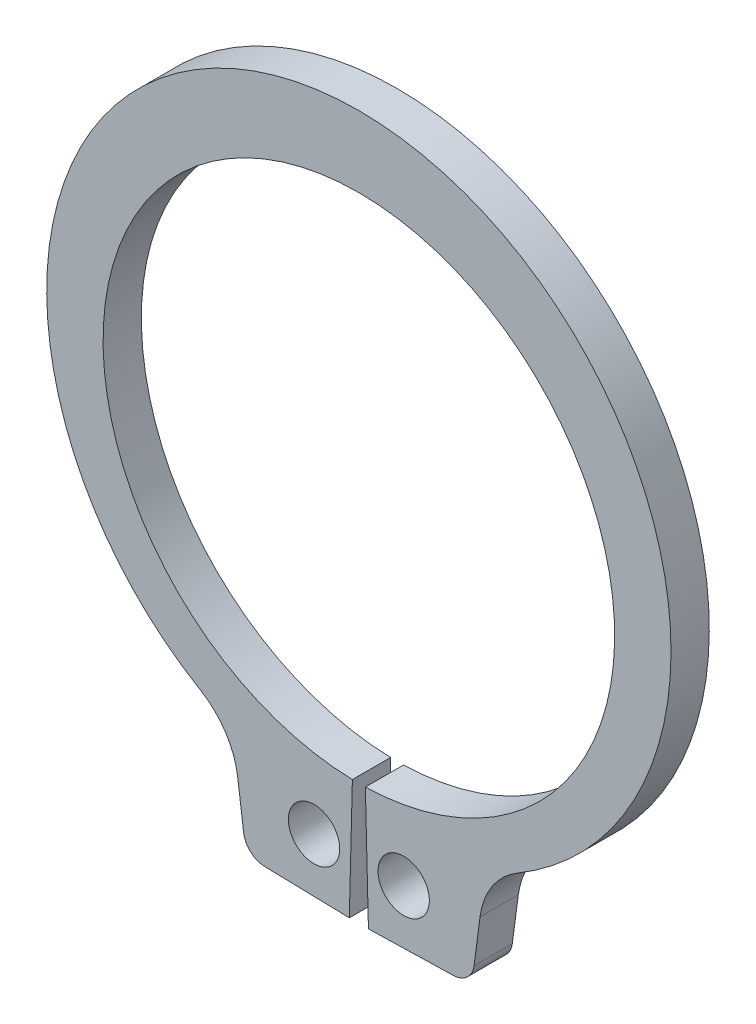
ISO-10303-21;
HEADER;
FILE_DESCRIPTION(('STEP AP214'),'2;1');
FILE_NAME('part.step','',(''),(''),'','','');
FILE_SCHEMA(('AUTOMOTIVE_DESIGN { 1 0 10303 214 1 1 1 1 }'));
ENDSEC;
DATA;
#1=APPLICATION_CONTEXT('core data for automotive mechanical design processes');
#2=APPLICATION_PROTOCOL_DEFINITION('international standard','automotive_design',2000,#1);
#3=PRODUCT_CONTEXT('',#1,'mechanical');
#4=PRODUCT('Part','Part','',(#3));
#5=PRODUCT_RELATED_PRODUCT_CATEGORY('part','',(#4));
#6=PRODUCT_DEFINITION_FORMATION('','',#4);
#7=PRODUCT_DEFINITION_CONTEXT('part definition',#1,'design');
#8=PRODUCT_DEFINITION('design','',#6,#7);
#9=PRODUCT_DEFINITION_SHAPE('','',#8);
#10=(LENGTH_UNIT() NAMED_UNIT(*) SI_UNIT(.MILLI.,.METRE.));
#11=(NAMED_UNIT(*) PLANE_ANGLE_UNIT() SI_UNIT($,.RADIAN.));
#12=(NAMED_UNIT(*) SI_UNIT($,.STERADIAN.) SOLID_ANGLE_UNIT());
#13=UNCERTAINTY_MEASURE_WITH_UNIT(LENGTH_MEASURE(1.E-05),#10,'distance_accuracy_value','');
#14=(GEOMETRIC_REPRESENTATION_CONTEXT(3) GLOBAL_UNCERTAINTY_ASSIGNED_CONTEXT((#13)) GLOBAL_UNIT_ASSIGNED_CONTEXT((#10,
#11,#12)) REPRESENTATION_CONTEXT('',''));
#15=CARTESIAN_POINT('',(0.,0.,0.));
#16=DIRECTION('',(0.,0.,1.));
#17=DIRECTION('',(1.,0.,0.));
#18=AXIS2_PLACEMENT_3D('',#15,#16,#17);
#19=CARTESIAN_POINT('',(0.,0.,-0.889));
#20=DIRECTION('',(0.,0.,1.));
#21=DIRECTION('',(1.,0.,0.));
#22=AXIS2_PLACEMENT_3D('',#19,#20,#21);
#23=CYLINDRICAL_SURFACE('',#22,5.9436);
#24=CARTESIAN_POINT('',(0.,0.,0.));
#25=DIRECTION('',(0.,0.,-1.));
#26=DIRECTION('',(1.,0.,0.));
#27=AXIS2_PLACEMENT_3D('',#24,#25,#26);
#28=CIRCLE('',#27,5.9436);
#29=CARTESIAN_POINT('',(-0.15074347826087,-5.94168809041352,0.));
#30=VERTEX_POINT('',#29);
#31=CARTESIAN_POINT('',(0.15074347826087,-5.94168809041352,0.));
#32=VERTEX_POINT('',#31);
#33=EDGE_CURVE('E159',#30,#32,#28,.T.);
#34=ORIENTED_EDGE('',*,*,#33,.F.);
#35=DIRECTION('',(0.,0.,1.));
#36=VECTOR('',#35,1.);
#37=CARTESIAN_POINT('',(-0.15074347826087,-5.94168809041352,-0.889));
#38=LINE('',#37,#36);
#39=CARTESIAN_POINT('',(-0.15074347826087,-5.94168809041352,-0.889));
#40=VERTEX_POINT('',#39);
#41=EDGE_CURVE('E11',#40,#30,#38,.T.);
#42=ORIENTED_EDGE('',*,*,#41,.F.);
#43=CARTESIAN_POINT('',(0.,0.,-0.889));
#44=DIRECTION('',(0.,0.,-1.));
#45=DIRECTION('',(1.,0.,0.));
#46=AXIS2_PLACEMENT_3D('',#43,#44,#45);
#47=CIRCLE('',#46,5.9436);
#48=CARTESIAN_POINT('',(0.15074347826087,-5.94168809041352,-0.889));
#49=VERTEX_POINT('',#48);
#50=EDGE_CURVE('E192',#40,#49,#47,.T.);
#51=ORIENTED_EDGE('',*,*,#50,.T.);
#52=DIRECTION('',(0.,0.,1.));
#53=VECTOR('',#52,1.);
#54=CARTESIAN_POINT('',(0.15074347826087,-5.94168809041352,-0.889));
#55=LINE('',#54,#53);
#56=EDGE_CURVE('E41',#49,#32,#55,.T.);
#57=ORIENTED_EDGE('',*,*,#56,.T.);
#58=EDGE_LOOP('',(#34,#42,#51,#57));
#59=FACE_BOUND('',#58,.T.);
#60=ADVANCED_FACE('F38',(#59),#23,.F.);
#61=CARTESIAN_POINT('',(-0.15074347826087,-5.94168809041352,-0.889));
#62=DIRECTION('',(0.999678324654,-0.0253623188405797,0.));
#63=DIRECTION('',(0.0253623188405797,0.999678324654,0.));
#64=AXIS2_PLACEMENT_3D('',#61,#62,#63);
#65=PLANE('',#64);
#66=DIRECTION('',(0.0253623188405797,0.999678324654,0.));
#67=VECTOR('',#66,1.);
#68=CARTESIAN_POINT('',(-0.15074347826087,-5.94168809041352,0.));
#69=LINE('',#68,#67);
#70=CARTESIAN_POINT('',(-0.22225,-8.76018115894301,0.));
#71=VERTEX_POINT('',#70);
#72=EDGE_CURVE('E190',#71,#30,#69,.T.);
#73=ORIENTED_EDGE('',*,*,#72,.F.);
#74=DIRECTION('',(0.,0.,1.));
#75=VECTOR('',#74,1.);
#76=CARTESIAN_POINT('',(-0.22225,-8.76018115894301,-0.889));
#77=LINE('',#76,#75);
#78=CARTESIAN_POINT('',(-0.22225,-8.76018115894301,-0.889));
#79=VERTEX_POINT('',#78);
#80=EDGE_CURVE('E47',#79,#71,#77,.T.);
#81=ORIENTED_EDGE('',*,*,#80,.F.);
#82=DIRECTION('',(0.0253623188405797,0.999678324654,0.));
#83=VECTOR('',#82,1.);
#84=CARTESIAN_POINT('',(-0.15074347826087,-5.94168809041352,-0.889));
#85=LINE('',#84,#83);
#86=EDGE_CURVE('E149',#79,#40,#85,.T.);
#87=ORIENTED_EDGE('',*,*,#86,.T.);
#88=ORIENTED_EDGE('',*,*,#41,.T.);
#89=EDGE_LOOP('',(#73,#81,#87,#88));
#90=FACE_BOUND('',#89,.T.);
#91=ADVANCED_FACE('F212',(#90),#65,.T.);
#92=CARTESIAN_POINT('',(-0.22225,-8.76018115894301,-0.889));
#93=DIRECTION('',(-0.0253623188405804,-0.999678324654,0.));
#94=DIRECTION('',(0.999678324654,-0.0253623188405804,0.));
#95=AXIS2_PLACEMENT_3D('',#92,#93,#94);
#96=PLANE('',#95);
#97=DIRECTION('',(0.999678324654,-0.0253623188405804,0.));
#98=VECTOR('',#97,1.);
#99=CARTESIAN_POINT('',(-0.22225,-8.76018115894301,0.));
#100=LINE('',#99,#98);
#101=CARTESIAN_POINT('',(-2.19350081150534,-8.71016957985485,0.));
#102=VERTEX_POINT('',#101);
#103=EDGE_CURVE('E136',#102,#71,#100,.T.);
#104=ORIENTED_EDGE('',*,*,#103,.F.);
#105=DIRECTION('',(0.,0.,1.));
#106=VECTOR('',#105,1.);
#107=CARTESIAN_POINT('',(-2.19350081150534,-8.71016957985485,-0.889));
#108=LINE('',#107,#106);
#109=CARTESIAN_POINT('',(-2.19350081150534,-8.71016957985485,-0.889));
#110=VERTEX_POINT('',#109);
#111=EDGE_CURVE('E131',#110,#102,#108,.T.);
#112=ORIENTED_EDGE('',*,*,#111,.F.);
#113=DIRECTION('',(0.999678324654,-0.0253623188405804,0.));
#114=VECTOR('',#113,1.);
#115=CARTESIAN_POINT('',(-0.22225,-8.76018115894301,-0.889));
#116=LINE('',#115,#114);
#117=EDGE_CURVE('E134',#110,#79,#116,.T.);
#118=ORIENTED_EDGE('',*,*,#117,.T.);
#119=ORIENTED_EDGE('',*,*,#80,.T.);
#120=EDGE_LOOP('',(#104,#112,#118,#119));
#121=FACE_BOUND('',#120,.T.);
#122=ADVANCED_FACE('F133',(#121),#96,.T.);
#123=CARTESIAN_POINT('',(-2.18081965208505,-8.21033041752785,-0.889));
#124=DIRECTION('',(0.,0.,1.));
#125=DIRECTION('',(1.,0.,0.));
#126=AXIS2_PLACEMENT_3D('',#123,#124,#125);
#127=CYLINDRICAL_SURFACE('',#126,0.5);
#128=CARTESIAN_POINT('',(-2.18081965208505,-8.21033041752785,0.));
#129=DIRECTION('',(0.,0.,1.));
#130=DIRECTION('',(1.,0.,0.));
#131=AXIS2_PLACEMENT_3D('',#128,#129,#130);
#132=CIRCLE('',#131,0.5);
#133=CARTESIAN_POINT('',(-2.67654208277196,-8.27559351363787,0.));
#134=VERTEX_POINT('',#133);
#135=EDGE_CURVE('E187',#134,#102,#132,.T.);
#136=ORIENTED_EDGE('',*,*,#135,.F.);
#137=DIRECTION('',(0.,0.,1.));
#138=VECTOR('',#137,1.);
#139=CARTESIAN_POINT('',(-2.67654208277196,-8.27559351363787,-0.889));
#140=LINE('',#139,#138);
#141=CARTESIAN_POINT('',(-2.67654208277196,-8.27559351363787,-0.889));
#142=VERTEX_POINT('',#141);
#143=EDGE_CURVE('E141',#142,#134,#140,.T.);
#144=ORIENTED_EDGE('',*,*,#143,.F.);
#145=CARTESIAN_POINT('',(-2.18081965208505,-8.21033041752785,-0.889));
#146=DIRECTION('',(0.,0.,1.));
#147=DIRECTION('',(1.,0.,0.));
#148=AXIS2_PLACEMENT_3D('',#145,#146,#147);
#149=CIRCLE('',#148,0.5);
#150=EDGE_CURVE('E147',#142,#110,#149,.T.);
#151=ORIENTED_EDGE('',*,*,#150,.T.);
#152=ORIENTED_EDGE('',*,*,#111,.T.);
#153=EDGE_LOOP('',(#136,#144,#151,#152));
#154=FACE_BOUND('',#153,.T.);
#155=ADVANCED_FACE('F151',(#154),#127,.T.);
#156=CARTESIAN_POINT('',(-2.81532005516637,-7.22147015906734,-0.889));
#157=DIRECTION('',(-0.99144486137381,-0.130526192220052,0.));
#158=DIRECTION('',(0.130526192220052,-0.99144486137381,0.));
#159=AXIS2_PLACEMENT_3D('',#156,#157,#158);
#160=PLANE('',#159);
#161=DIRECTION('',(0.130526192220052,-0.99144486137381,0.));
#162=VECTOR('',#161,1.);
#163=CARTESIAN_POINT('',(-2.81532005516637,-7.22147015906734,0.));
#164=LINE('',#163,#162);
#165=CARTESIAN_POINT('',(-2.81532005516637,-7.22147015906734,0.));
#166=VERTEX_POINT('',#165);
#167=EDGE_CURVE('E184',#166,#134,#164,.T.);
#168=ORIENTED_EDGE('',*,*,#167,.F.);
#169=DIRECTION('',(0.,0.,1.));
#170=VECTOR('',#169,1.);
#171=CARTESIAN_POINT('',(-2.81532005516637,-7.22147015906734,-0.889));
#172=LINE('',#171,#170);
#173=CARTESIAN_POINT('',(-2.81532005516637,-7.22147015906734,-0.889));
#174=VERTEX_POINT('',#173);
#175=EDGE_CURVE('E196',#174,#166,#172,.T.);
#176=ORIENTED_EDGE('',*,*,#175,.F.);
#177=DIRECTION('',(0.130526192220052,-0.99144486137381,0.));
#178=VECTOR('',#177,1.);
#179=CARTESIAN_POINT('',(-2.81532005516637,-7.22147015906734,-0.889));
#180=LINE('',#179,#178);
#181=EDGE_CURVE('E152',#174,#142,#180,.T.);
#182=ORIENTED_EDGE('',*,*,#181,.T.);
#183=ORIENTED_EDGE('',*,*,#143,.T.);
#184=EDGE_LOOP('',(#168,#176,#182,#183));
#185=FACE_BOUND('',#184,.T.);
#186=ADVANCED_FACE('F225',(#185),#160,.T.);
#187=CARTESIAN_POINT('',(-4.60285275575283,-7.45680330361869,-0.889));
#188=DIRECTION('',(0.,0.,1.));
#189=DIRECTION('',(1.,0.,0.));
#190=AXIS2_PLACEMENT_3D('',#187,#188,#189);
#191=CYLINDRICAL_SURFACE('',#190,1.80295724979555);
#192=CARTESIAN_POINT('',(-4.60285275575283,-7.45680330361869,0.));
#193=DIRECTION('',(0.,0.,-1.));
#194=DIRECTION('',(1.,0.,0.));
#195=AXIS2_PLACEMENT_3D('',#192,#193,#194);
#196=CIRCLE('',#195,1.80295724979555);
#197=CARTESIAN_POINT('',(-3.6864403239202,-5.90411431371346,0.));
#198=VERTEX_POINT('',#197);
#199=EDGE_CURVE('E181',#198,#166,#196,.T.);
#200=ORIENTED_EDGE('',*,*,#199,.F.);
#201=DIRECTION('',(0.,0.,1.));
#202=VECTOR('',#201,1.);
#203=CARTESIAN_POINT('',(-3.6864403239202,-5.90411431371346,-0.889));
#204=LINE('',#203,#202);
#205=CARTESIAN_POINT('',(-3.6864403239202,-5.90411431371346,-0.889));
#206=VERTEX_POINT('',#205);
#207=EDGE_CURVE('E198',#206,#198,#204,.T.);
#208=ORIENTED_EDGE('',*,*,#207,.F.);
#209=CARTESIAN_POINT('',(-4.60285275575283,-7.45680330361869,-0.889));
#210=DIRECTION('',(0.,0.,-1.));
#211=DIRECTION('',(1.,0.,0.));
#212=AXIS2_PLACEMENT_3D('',#209,#210,#211);
#213=CIRCLE('',#212,1.80295724979555);
#214=EDGE_CURVE('E154',#206,#174,#213,.T.);
#215=ORIENTED_EDGE('',*,*,#214,.T.);
#216=ORIENTED_EDGE('',*,*,#175,.T.);
#217=EDGE_LOOP('',(#200,#208,#215,#216));
#218=FACE_BOUND('',#217,.T.);
#219=ADVANCED_FACE('F228',(#218),#191,.F.);
#220=CARTESIAN_POINT('',(0.,0.341867412491376,-0.889));
#221=DIRECTION('',(0.,0.,1.));
#222=DIRECTION('',(1.,0.,0.));
#223=AXIS2_PLACEMENT_3D('',#220,#221,#222);
#224=CYLINDRICAL_SURFACE('',#223,7.25273258750863);
#225=CARTESIAN_POINT('',(0.,0.341867412491376,0.));
#226=DIRECTION('',(0.,0.,1.));
#227=DIRECTION('',(1.,0.,0.));
#228=AXIS2_PLACEMENT_3D('',#225,#226,#227);
#229=CIRCLE('',#228,7.25273258750863);
#230=CARTESIAN_POINT('',(3.6864403239202,-5.90411431371346,0.));
#231=VERTEX_POINT('',#230);
#232=EDGE_CURVE('E178',#231,#198,#229,.T.);
#233=ORIENTED_EDGE('',*,*,#232,.F.);
#234=DIRECTION('',(0.,0.,1.));
#235=VECTOR('',#234,1.);
#236=CARTESIAN_POINT('',(3.6864403239202,-5.90411431371346,-0.889));
#237=LINE('',#236,#235);
#238=CARTESIAN_POINT('',(3.6864403239202,-5.90411431371346,-0.889));
#239=VERTEX_POINT('',#238);
#240=EDGE_CURVE('E200',#239,#231,#237,.T.);
#241=ORIENTED_EDGE('',*,*,#240,.F.);
#242=CARTESIAN_POINT('',(0.,0.341867412491376,-0.889));
#243=DIRECTION('',(0.,0.,1.));
#244=DIRECTION('',(1.,0.,0.));
#245=AXIS2_PLACEMENT_3D('',#242,#243,#244);
#246=CIRCLE('',#245,7.25273258750863);
#247=EDGE_CURVE('E302',#239,#206,#246,.T.);
#248=ORIENTED_EDGE('',*,*,#247,.T.);
#249=ORIENTED_EDGE('',*,*,#207,.T.);
#250=EDGE_LOOP('',(#233,#241,#248,#249));
#251=FACE_BOUND('',#250,.T.);
#252=ADVANCED_FACE('F232',(#251),#224,.T.);
#253=CARTESIAN_POINT('',(4.60285275575283,-7.45680330361869,-0.889));
#254=DIRECTION('',(0.,0.,1.));
#255=DIRECTION('',(1.,0.,0.));
#256=AXIS2_PLACEMENT_3D('',#253,#254,#255);
#257=CYLINDRICAL_SURFACE('',#256,1.80295724979555);
#258=CARTESIAN_POINT('',(4.60285275575283,-7.45680330361869,0.));
#259=DIRECTION('',(0.,0.,-1.));
#260=DIRECTION('',(1.,0.,0.));
#261=AXIS2_PLACEMENT_3D('',#258,#259,#260);
#262=CIRCLE('',#261,1.80295724979555);
#263=CARTESIAN_POINT('',(2.81532005516637,-7.22147015906734,0.));
#264=VERTEX_POINT('',#263);
#265=EDGE_CURVE('E175',#264,#231,#262,.T.);
#266=ORIENTED_EDGE('',*,*,#265,.F.);
#267=DIRECTION('',(0.,0.,1.));
#268=VECTOR('',#267,1.);
#269=CARTESIAN_POINT('',(2.81532005516637,-7.22147015906734,-0.889));
#270=LINE('',#269,#268);
#271=CARTESIAN_POINT('',(2.81532005516637,-7.22147015906734,-0.889));
#272=VERTEX_POINT('',#271);
#273=EDGE_CURVE('E202',#272,#264,#270,.T.);
#274=ORIENTED_EDGE('',*,*,#273,.F.);
#275=CARTESIAN_POINT('',(4.60285275575283,-7.45680330361869,-0.889));
#276=DIRECTION('',(0.,0.,-1.));
#277=DIRECTION('',(1.,0.,0.));
#278=AXIS2_PLACEMENT_3D('',#275,#276,#277);
#279=CIRCLE('',#278,1.80295724979555);
#280=EDGE_CURVE('E299',#272,#239,#279,.T.);
#281=ORIENTED_EDGE('',*,*,#280,.T.);
#282=ORIENTED_EDGE('',*,*,#240,.T.);
#283=EDGE_LOOP('',(#266,#274,#281,#282));
#284=FACE_BOUND('',#283,.T.);
#285=ADVANCED_FACE('F236',(#284),#257,.F.);
#286=CARTESIAN_POINT('',(2.81532005516637,-7.22147015906734,-0.889));
#287=DIRECTION('',(0.99144486137381,-0.130526192220052,0.));
#288=DIRECTION('',(0.130526192220052,0.99144486137381,0.));
#289=AXIS2_PLACEMENT_3D('',#286,#287,#288);
#290=PLANE('',#289);
#291=DIRECTION('',(0.130526192220052,0.99144486137381,0.));
#292=VECTOR('',#291,1.);
#293=CARTESIAN_POINT('',(2.81532005516637,-7.22147015906734,0.));
#294=LINE('',#293,#292);
#295=CARTESIAN_POINT('',(2.67654208277196,-8.27559351363787,0.));
#296=VERTEX_POINT('',#295);
#297=EDGE_CURVE('E172',#296,#264,#294,.T.);
#298=ORIENTED_EDGE('',*,*,#297,.F.);
#299=DIRECTION('',(0.,0.,1.));
#300=VECTOR('',#299,1.);
#301=CARTESIAN_POINT('',(2.67654208277196,-8.27559351363787,-0.889));
#302=LINE('',#301,#300);
#303=CARTESIAN_POINT('',(2.67654208277196,-8.27559351363787,-0.889));
#304=VERTEX_POINT('',#303);
#305=EDGE_CURVE('E204',#304,#296,#302,.T.);
#306=ORIENTED_EDGE('',*,*,#305,.F.);
#307=DIRECTION('',(0.130526192220052,0.99144486137381,0.));
#308=VECTOR('',#307,1.);
#309=CARTESIAN_POINT('',(2.81532005516637,-7.22147015906734,-0.889));
#310=LINE('',#309,#308);
#311=EDGE_CURVE('E296',#304,#272,#310,.T.);
#312=ORIENTED_EDGE('',*,*,#311,.T.);
#313=ORIENTED_EDGE('',*,*,#273,.T.);
#314=EDGE_LOOP('',(#298,#306,#312,#313));
#315=FACE_BOUND('',#314,.T.);
#316=ADVANCED_FACE('F240',(#315),#290,.T.);
#317=CARTESIAN_POINT('',(2.18081965208505,-8.21033041752785,-0.889));
#318=DIRECTION('',(0.,0.,1.));
#319=DIRECTION('',(1.,0.,0.));
#320=AXIS2_PLACEMENT_3D('',#317,#318,#319);
#321=CYLINDRICAL_SURFACE('',#320,0.5);
#322=CARTESIAN_POINT('',(2.18081965208505,-8.21033041752785,0.));
#323=DIRECTION('',(0.,0.,1.));
#324=DIRECTION('',(-1.,0.,0.));
#325=AXIS2_PLACEMENT_3D('',#322,#323,#324);
#326=CIRCLE('',#325,0.5);
#327=CARTESIAN_POINT('',(2.19350081150534,-8.71016957985485,0.));
#328=VERTEX_POINT('',#327);
#329=EDGE_CURVE('E169',#328,#296,#326,.T.);
#330=ORIENTED_EDGE('',*,*,#329,.F.);
#331=DIRECTION('',(0.,0.,1.));
#332=VECTOR('',#331,1.);
#333=CARTESIAN_POINT('',(2.19350081150534,-8.71016957985485,-0.889));
#334=LINE('',#333,#332);
#335=CARTESIAN_POINT('',(2.19350081150534,-8.71016957985485,-0.889));
#336=VERTEX_POINT('',#335);
#337=EDGE_CURVE('E206',#336,#328,#334,.T.);
#338=ORIENTED_EDGE('',*,*,#337,.F.);
#339=CARTESIAN_POINT('',(2.18081965208505,-8.21033041752785,-0.889));
#340=DIRECTION('',(0.,0.,1.));
#341=DIRECTION('',(-1.,0.,0.));
#342=AXIS2_PLACEMENT_3D('',#339,#340,#341);
#343=CIRCLE('',#342,0.5);
#344=EDGE_CURVE('E293',#336,#304,#343,.T.);
#345=ORIENTED_EDGE('',*,*,#344,.T.);
#346=ORIENTED_EDGE('',*,*,#305,.T.);
#347=EDGE_LOOP('',(#330,#338,#345,#346));
#348=FACE_BOUND('',#347,.T.);
#349=ADVANCED_FACE('F244',(#348),#321,.T.);
#350=CARTESIAN_POINT('',(0.22225,-8.76018115894301,-0.889));
#351=DIRECTION('',(0.0253623188405804,-0.999678324654,0.));
#352=DIRECTION('',(0.999678324654,0.0253623188405804,0.));
#353=AXIS2_PLACEMENT_3D('',#350,#351,#352);
#354=PLANE('',#353);
#355=DIRECTION('',(0.999678324654,0.0253623188405804,0.));
#356=VECTOR('',#355,1.);
#357=CARTESIAN_POINT('',(0.22225,-8.76018115894301,0.));
#358=LINE('',#357,#356);
#359=CARTESIAN_POINT('',(0.22225,-8.76018115894301,0.));
#360=VERTEX_POINT('',#359);
#361=EDGE_CURVE('E166',#360,#328,#358,.T.);
#362=ORIENTED_EDGE('',*,*,#361,.F.);
#363=DIRECTION('',(0.,0.,1.));
#364=VECTOR('',#363,1.);
#365=CARTESIAN_POINT('',(0.22225,-8.76018115894301,-0.889));
#366=LINE('',#365,#364);
#367=CARTESIAN_POINT('',(0.22225,-8.76018115894301,-0.889));
#368=VERTEX_POINT('',#367);
#369=EDGE_CURVE('E207',#368,#360,#366,.T.);
#370=ORIENTED_EDGE('',*,*,#369,.F.);
#371=DIRECTION('',(0.999678324654,0.0253623188405804,0.));
#372=VECTOR('',#371,1.);
#373=CARTESIAN_POINT('',(0.22225,-8.76018115894301,-0.889));
#374=LINE('',#373,#372);
#375=EDGE_CURVE('E290',#368,#336,#374,.T.);
#376=ORIENTED_EDGE('',*,*,#375,.T.);
#377=ORIENTED_EDGE('',*,*,#337,.T.);
#378=EDGE_LOOP('',(#362,#370,#376,#377));
#379=FACE_BOUND('',#378,.T.);
#380=ADVANCED_FACE('F248',(#379),#354,.T.);
#381=CARTESIAN_POINT('',(0.15074347826087,-5.94168809041352,-0.889));
#382=DIRECTION('',(-0.999678324654,-0.0253623188405797,0.));
#383=DIRECTION('',(0.0253623188405797,-0.999678324654,0.));
#384=AXIS2_PLACEMENT_3D('',#381,#382,#383);
#385=PLANE('',#384);
#386=DIRECTION('',(0.0253623188405797,-0.999678324654,0.));
#387=VECTOR('',#386,1.);
#388=CARTESIAN_POINT('',(0.15074347826087,-5.94168809041352,0.));
#389=LINE('',#388,#387);
#390=EDGE_CURVE('E162',#32,#360,#389,.T.);
#391=ORIENTED_EDGE('',*,*,#390,.F.);
#392=ORIENTED_EDGE('',*,*,#56,.F.);
#393=DIRECTION('',(0.0253623188405797,-0.999678324654,0.));
#394=VECTOR('',#393,1.);
#395=CARTESIAN_POINT('',(0.15074347826087,-5.94168809041352,-0.889));
#396=LINE('',#395,#394);
#397=EDGE_CURVE('E288',#49,#368,#396,.T.);
#398=ORIENTED_EDGE('',*,*,#397,.T.);
#399=ORIENTED_EDGE('',*,*,#369,.T.);
#400=EDGE_LOOP('',(#391,#392,#398,#399));
#401=FACE_BOUND('',#400,.T.);
#402=ADVANCED_FACE('F209',(#401),#385,.T.);
#403=CARTESIAN_POINT('',(0.,0.,-0.889));
#404=DIRECTION('',(0.,0.,1.));
#405=DIRECTION('',(1.,0.,0.));
#406=AXIS2_PLACEMENT_3D('',#403,#404,#405);
#407=PLANE('',#406);
#408=CARTESIAN_POINT('',(-1.0414,-7.48439565295689,-0.889));
#409=DIRECTION('',(0.,0.,1.));
#410=DIRECTION('',(1.,0.,0.));
#411=AXIS2_PLACEMENT_3D('',#408,#409,#410);
#412=CIRCLE('',#411,0.5969);
#413=CARTESIAN_POINT('',(-0.4445,-7.48439565295689,-0.889));
#414=VERTEX_POINT('',#413);
#415=EDGE_CURVE('E275',#414,#414,#412,.T.);
#416=ORIENTED_EDGE('',*,*,#415,.T.);
#417=EDGE_LOOP('',(#416));
#418=FACE_BOUND('',#417,.T.);
#419=CARTESIAN_POINT('',(1.0414,-7.48439565295689,-0.889));
#420=DIRECTION('',(0.,0.,1.));
#421=DIRECTION('',(1.,0.,0.));
#422=AXIS2_PLACEMENT_3D('',#419,#420,#421);
#423=CIRCLE('',#422,0.5969);
#424=CARTESIAN_POINT('',(1.6383,-7.48439565295689,-0.889));
#425=VERTEX_POINT('',#424);
#426=EDGE_CURVE('E163',#425,#425,#423,.T.);
#427=ORIENTED_EDGE('',*,*,#426,.T.);
#428=EDGE_LOOP('',(#427));
#429=FACE_BOUND('',#428,.T.);
#430=ORIENTED_EDGE('',*,*,#50,.F.);
#431=ORIENTED_EDGE('',*,*,#86,.F.);
#432=ORIENTED_EDGE('',*,*,#117,.F.);
#433=ORIENTED_EDGE('',*,*,#150,.F.);
#434=ORIENTED_EDGE('',*,*,#181,.F.);
#435=ORIENTED_EDGE('',*,*,#214,.F.);
#436=ORIENTED_EDGE('',*,*,#247,.F.);
#437=ORIENTED_EDGE('',*,*,#280,.F.);
#438=ORIENTED_EDGE('',*,*,#311,.F.);
#439=ORIENTED_EDGE('',*,*,#344,.F.);
#440=ORIENTED_EDGE('',*,*,#375,.F.);
#441=ORIENTED_EDGE('',*,*,#397,.F.);
#442=EDGE_LOOP('',(#430,#431,#432,#433,#434,#435,#436,#437,#438,#439,#440,#441));
#443=FACE_BOUND('',#442,.T.);
#444=ADVANCED_FACE('F145',(#418,#429,#443),#407,.F.);
#445=CARTESIAN_POINT('',(0.,0.,0.));
#446=DIRECTION('',(0.,0.,1.));
#447=DIRECTION('',(1.,0.,0.));
#448=AXIS2_PLACEMENT_3D('',#445,#446,#447);
#449=PLANE('',#448);
#450=CARTESIAN_POINT('',(-1.0414,-7.48439565295689,0.));
#451=DIRECTION('',(0.,0.,1.));
#452=DIRECTION('',(1.,0.,0.));
#453=AXIS2_PLACEMENT_3D('',#450,#451,#452);
#454=CIRCLE('',#453,0.5969);
#455=CARTESIAN_POINT('',(-0.4445,-7.48439565295689,0.));
#456=VERTEX_POINT('',#455);
#457=EDGE_CURVE('E278',#456,#456,#454,.T.);
#458=ORIENTED_EDGE('',*,*,#457,.F.);
#459=EDGE_LOOP('',(#458));
#460=FACE_BOUND('',#459,.T.);
#461=CARTESIAN_POINT('',(1.0414,-7.48439565295689,0.));
#462=DIRECTION('',(0.,0.,1.));
#463=DIRECTION('',(1.,0.,0.));
#464=AXIS2_PLACEMENT_3D('',#461,#462,#463);
#465=CIRCLE('',#464,0.5969);
#466=CARTESIAN_POINT('',(1.6383,-7.48439565295689,0.));
#467=VERTEX_POINT('',#466);
#468=EDGE_CURVE('E280',#467,#467,#465,.T.);
#469=ORIENTED_EDGE('',*,*,#468,.F.);
#470=EDGE_LOOP('',(#469));
#471=FACE_BOUND('',#470,.T.);
#472=ORIENTED_EDGE('',*,*,#33,.T.);
#473=ORIENTED_EDGE('',*,*,#390,.T.);
#474=ORIENTED_EDGE('',*,*,#361,.T.);
#475=ORIENTED_EDGE('',*,*,#329,.T.);
#476=ORIENTED_EDGE('',*,*,#297,.T.);
#477=ORIENTED_EDGE('',*,*,#265,.T.);
#478=ORIENTED_EDGE('',*,*,#232,.T.);
#479=ORIENTED_EDGE('',*,*,#199,.T.);
#480=ORIENTED_EDGE('',*,*,#167,.T.);
#481=ORIENTED_EDGE('',*,*,#135,.T.);
#482=ORIENTED_EDGE('',*,*,#103,.T.);
#483=ORIENTED_EDGE('',*,*,#72,.T.);
#484=EDGE_LOOP('',(#472,#473,#474,#475,#476,#477,#478,#479,#480,#481,#482,#483));
#485=FACE_BOUND('',#484,.T.);
#486=ADVANCED_FACE('F211',(#460,#471,#485),#449,.T.);
#487=CARTESIAN_POINT('',(1.0414,-7.48439565295689,-0.889));
#488=DIRECTION('',(0.,0.,1.));
#489=DIRECTION('',(1.,0.,0.));
#490=AXIS2_PLACEMENT_3D('',#487,#488,#489);
#491=CYLINDRICAL_SURFACE('',#490,0.5969);
#492=ORIENTED_EDGE('',*,*,#426,.F.);
#493=EDGE_LOOP('',(#492));
#494=FACE_BOUND('',#493,.T.);
#495=ORIENTED_EDGE('',*,*,#468,.T.);
#496=EDGE_LOOP('',(#495));
#497=FACE_BOUND('',#496,.T.);
#498=ADVANCED_FACE('F260',(#494,#497),#491,.F.);
#499=CARTESIAN_POINT('',(-1.0414,-7.48439565295689,-0.889));
#500=DIRECTION('',(0.,0.,1.));
#501=DIRECTION('',(1.,0.,0.));
#502=AXIS2_PLACEMENT_3D('',#499,#500,#501);
#503=CYLINDRICAL_SURFACE('',#502,0.5969);
#504=ORIENTED_EDGE('',*,*,#415,.F.);
#505=EDGE_LOOP('',(#504));
#506=FACE_BOUND('',#505,.T.);
#507=ORIENTED_EDGE('',*,*,#457,.T.);
#508=EDGE_LOOP('',(#507));
#509=FACE_BOUND('',#508,.T.);
#510=ADVANCED_FACE('F267',(#506,#509),#503,.F.);
#511=CLOSED_SHELL('',(#60,#91,#122,#155,#186,#219,#252,#285,#316,#349,#380,#402,#444,#486,#498,#510));
#512=MANIFOLD_SOLID_BREP('B2',#511);
#513=ADVANCED_BREP_SHAPE_REPRESENTATION('',(#18,#512),#14);
#514=SHAPE_DEFINITION_REPRESENTATION(#9,#513);
ENDSEC;
END-ISO-10303-21;
